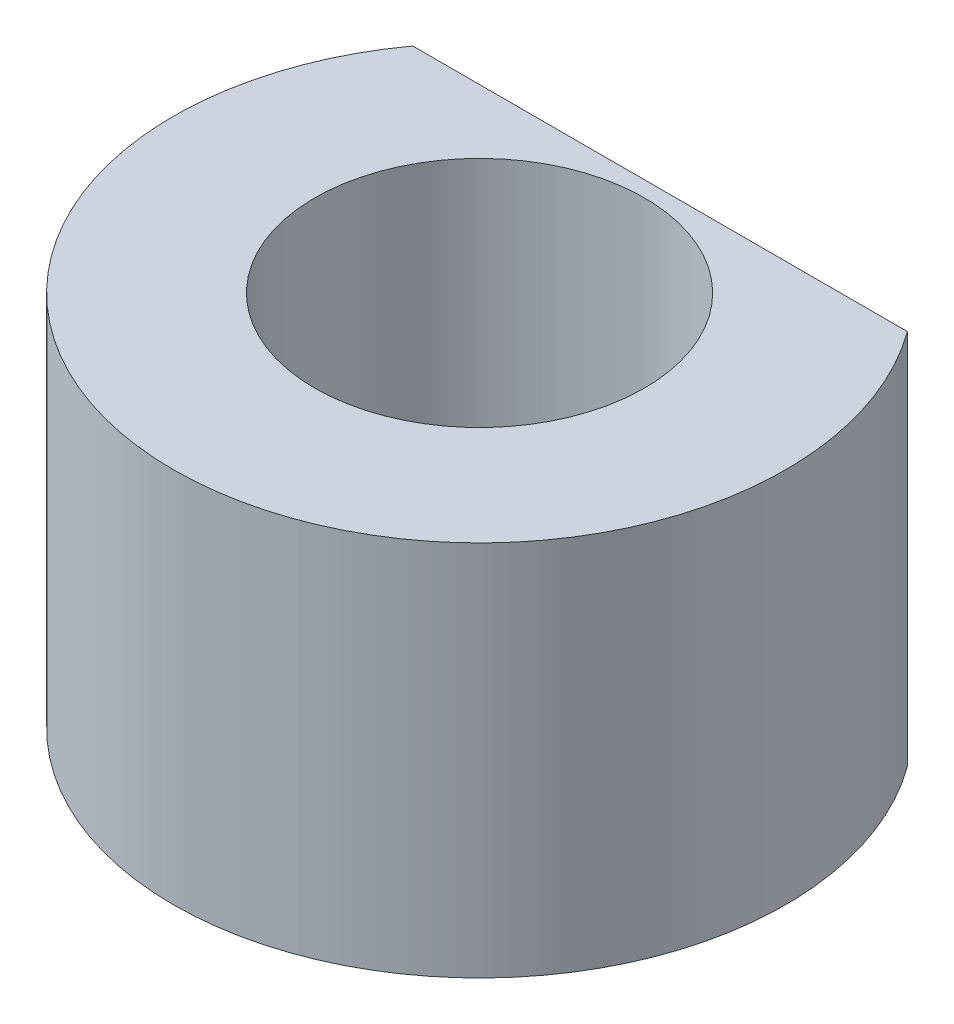
ISO-10303-21;
HEADER;
FILE_DESCRIPTION(('STEP AP214'),'2;1');
FILE_NAME('part.step','',(''),(''),'','','');
FILE_SCHEMA(('AUTOMOTIVE_DESIGN { 1 0 10303 214 1 1 1 1 }'));
ENDSEC;
DATA;
#1=APPLICATION_CONTEXT('core data for automotive mechanical design processes');
#2=APPLICATION_PROTOCOL_DEFINITION('international standard','automotive_design',2000,#1);
#3=PRODUCT_CONTEXT('',#1,'mechanical');
#4=PRODUCT('Part','Part','',(#3));
#5=PRODUCT_RELATED_PRODUCT_CATEGORY('part','',(#4));
#6=PRODUCT_DEFINITION_FORMATION('','',#4);
#7=PRODUCT_DEFINITION_CONTEXT('part definition',#1,'design');
#8=PRODUCT_DEFINITION('design','',#6,#7);
#9=PRODUCT_DEFINITION_SHAPE('','',#8);
#10=(LENGTH_UNIT() NAMED_UNIT(*) SI_UNIT(.MILLI.,.METRE.));
#11=(NAMED_UNIT(*) PLANE_ANGLE_UNIT() SI_UNIT($,.RADIAN.));
#12=(NAMED_UNIT(*) SI_UNIT($,.STERADIAN.) SOLID_ANGLE_UNIT());
#13=UNCERTAINTY_MEASURE_WITH_UNIT(LENGTH_MEASURE(1.E-05),#10,'distance_accuracy_value','');
#14=(GEOMETRIC_REPRESENTATION_CONTEXT(3) GLOBAL_UNCERTAINTY_ASSIGNED_CONTEXT((#13)) GLOBAL_UNIT_ASSIGNED_CONTEXT((#10,
#11,#12)) REPRESENTATION_CONTEXT('',''));
#15=CARTESIAN_POINT('',(0.,0.,0.));
#16=DIRECTION('',(0.,0.,1.));
#17=DIRECTION('',(1.,0.,0.));
#18=AXIS2_PLACEMENT_3D('',#15,#16,#17);
#19=CARTESIAN_POINT('',(0.,2.4,-1.14972822875669));
#20=DIRECTION('',(0.,0.,-1.));
#21=DIRECTION('',(-1.,0.,0.));
#22=AXIS2_PLACEMENT_3D('',#19,#20,#21);
#23=PLANE('',#22);
#24=DIRECTION('',(1.,0.,0.));
#25=VECTOR('',#24,1.);
#26=CARTESIAN_POINT('',(0.,0.,-1.14972822875669));
#27=LINE('',#26,#25);
#28=CARTESIAN_POINT('',(-1.575,0.,-1.14972822875669));
#29=VERTEX_POINT('',#28);
#30=CARTESIAN_POINT('',(1.575,0.,-1.14972822875669));
#31=VERTEX_POINT('',#30);
#32=EDGE_CURVE('E65',#29,#31,#27,.T.);
#33=ORIENTED_EDGE('',*,*,#32,.F.);
#34=DIRECTION('',(0.,-1.,0.));
#35=VECTOR('',#34,1.);
#36=CARTESIAN_POINT('',(-1.575,2.4,-1.14972822875669));
#37=LINE('',#36,#35);
#38=CARTESIAN_POINT('',(-1.575,2.4,-1.14972822875669));
#39=VERTEX_POINT('',#38);
#40=EDGE_CURVE('E11',#39,#29,#37,.T.);
#41=ORIENTED_EDGE('',*,*,#40,.F.);
#42=DIRECTION('',(1.,0.,0.));
#43=VECTOR('',#42,1.);
#44=CARTESIAN_POINT('',(0.,2.4,-1.14972822875669));
#45=LINE('',#44,#43);
#46=CARTESIAN_POINT('',(1.575,2.4,-1.14972822875669));
#47=VERTEX_POINT('',#46);
#48=EDGE_CURVE('E66',#39,#47,#45,.T.);
#49=ORIENTED_EDGE('',*,*,#48,.T.);
#50=DIRECTION('',(0.,-1.,0.));
#51=VECTOR('',#50,1.);
#52=CARTESIAN_POINT('',(1.575,2.4,-1.14972822875669));
#53=LINE('',#52,#51);
#54=EDGE_CURVE('E45',#47,#31,#53,.T.);
#55=ORIENTED_EDGE('',*,*,#54,.T.);
#56=EDGE_LOOP('',(#33,#41,#49,#55));
#57=FACE_BOUND('',#56,.T.);
#58=ADVANCED_FACE('F37',(#57),#23,.T.);
#59=CARTESIAN_POINT('',(0.,2.4,0.));
#60=DIRECTION('',(0.,-1.,0.));
#61=DIRECTION('',(0.,0.,-1.));
#62=AXIS2_PLACEMENT_3D('',#59,#60,#61);
#63=CYLINDRICAL_SURFACE('',#62,1.95);
#64=CARTESIAN_POINT('',(0.,0.,0.));
#65=DIRECTION('',(0.,1.,0.));
#66=DIRECTION('',(0.,0.,1.));
#67=AXIS2_PLACEMENT_3D('',#64,#65,#66);
#68=CIRCLE('',#67,1.95);
#69=EDGE_CURVE('E67',#29,#31,#68,.T.);
#70=ORIENTED_EDGE('',*,*,#69,.T.);
#71=ORIENTED_EDGE('',*,*,#54,.F.);
#72=CARTESIAN_POINT('',(0.,2.4,0.));
#73=DIRECTION('',(0.,1.,0.));
#74=DIRECTION('',(0.,0.,1.));
#75=AXIS2_PLACEMENT_3D('',#72,#73,#74);
#76=CIRCLE('',#75,1.95);
#77=EDGE_CURVE('E52',#39,#47,#76,.T.);
#78=ORIENTED_EDGE('',*,*,#77,.F.);
#79=ORIENTED_EDGE('',*,*,#40,.T.);
#80=EDGE_LOOP('',(#70,#71,#78,#79));
#81=FACE_BOUND('',#80,.T.);
#82=ADVANCED_FACE('F68',(#81),#63,.T.);
#83=CARTESIAN_POINT('',(0.,2.4,0.));
#84=DIRECTION('',(0.,1.,0.));
#85=DIRECTION('',(0.,0.,1.));
#86=AXIS2_PLACEMENT_3D('',#83,#84,#85);
#87=PLANE('',#86);
#88=CARTESIAN_POINT('',(0.,2.4,0.));
#89=DIRECTION('',(0.,1.,0.));
#90=DIRECTION('',(0.,0.,1.));
#91=AXIS2_PLACEMENT_3D('',#88,#89,#90);
#92=CIRCLE('',#91,1.05);
#93=CARTESIAN_POINT('',(0.,2.4,1.05));
#94=VERTEX_POINT('',#93);
#95=EDGE_CURVE('E75',#94,#94,#92,.T.);
#96=ORIENTED_EDGE('',*,*,#95,.F.);
#97=EDGE_LOOP('',(#96));
#98=FACE_BOUND('',#97,.T.);
#99=ORIENTED_EDGE('',*,*,#48,.F.);
#100=ORIENTED_EDGE('',*,*,#77,.T.);
#101=EDGE_LOOP('',(#99,#100));
#102=FACE_BOUND('',#101,.T.);
#103=ADVANCED_FACE('F85',(#98,#102),#87,.T.);
#104=CARTESIAN_POINT('',(0.,0.,0.));
#105=DIRECTION('',(0.,1.,0.));
#106=DIRECTION('',(0.,0.,1.));
#107=AXIS2_PLACEMENT_3D('',#104,#105,#106);
#108=PLANE('',#107);
#109=CARTESIAN_POINT('',(0.,0.,0.));
#110=DIRECTION('',(0.,1.,0.));
#111=DIRECTION('',(0.,0.,1.));
#112=AXIS2_PLACEMENT_3D('',#109,#110,#111);
#113=CIRCLE('',#112,1.05);
#114=CARTESIAN_POINT('',(0.,0.,1.05));
#115=VERTEX_POINT('',#114);
#116=EDGE_CURVE('E72',#115,#115,#113,.T.);
#117=ORIENTED_EDGE('',*,*,#116,.T.);
#118=EDGE_LOOP('',(#117));
#119=FACE_BOUND('',#118,.T.);
#120=ORIENTED_EDGE('',*,*,#32,.T.);
#121=ORIENTED_EDGE('',*,*,#69,.F.);
#122=EDGE_LOOP('',(#120,#121));
#123=FACE_BOUND('',#122,.T.);
#124=ADVANCED_FACE('F71',(#119,#123),#108,.F.);
#125=CARTESIAN_POINT('',(0.,0.,0.));
#126=DIRECTION('',(0.,1.,0.));
#127=DIRECTION('',(0.,0.,1.));
#128=AXIS2_PLACEMENT_3D('',#125,#126,#127);
#129=CYLINDRICAL_SURFACE('',#128,1.05);
#130=ORIENTED_EDGE('',*,*,#116,.F.);
#131=EDGE_LOOP('',(#130));
#132=FACE_BOUND('',#131,.T.);
#133=ORIENTED_EDGE('',*,*,#95,.T.);
#134=EDGE_LOOP('',(#133));
#135=FACE_BOUND('',#134,.T.);
#136=ADVANCED_FACE('F83',(#132,#135),#129,.F.);
#137=CLOSED_SHELL('',(#58,#82,#103,#124,#136));
#138=MANIFOLD_SOLID_BREP('B2',#137);
#139=ADVANCED_BREP_SHAPE_REPRESENTATION('',(#18,#138),#14);
#140=SHAPE_DEFINITION_REPRESENTATION(#9,#139);
ENDSEC;
END-ISO-10303-21;
